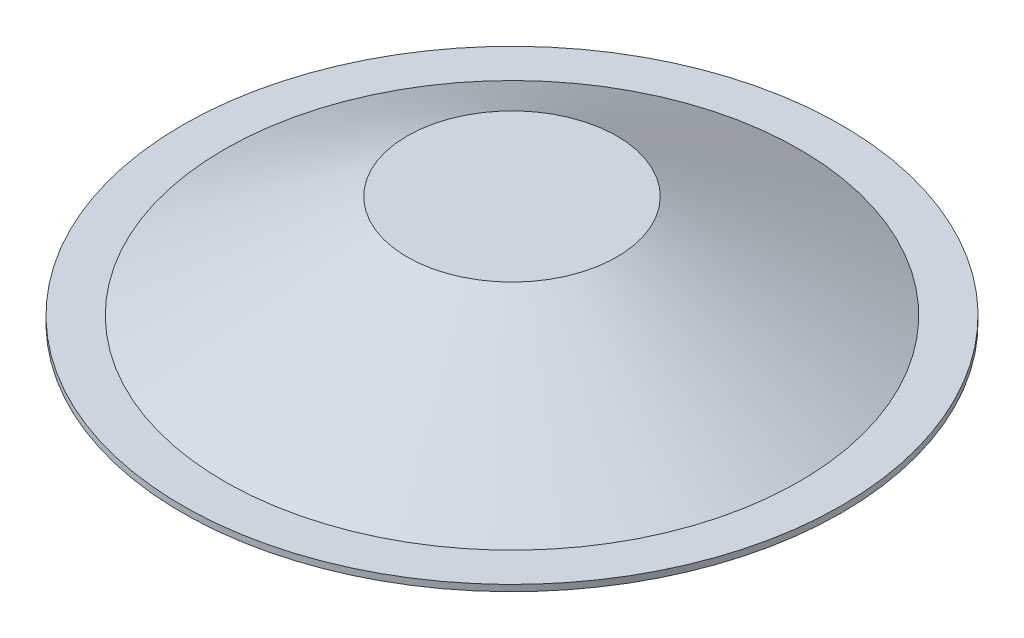
ISO-10303-21;
HEADER;
FILE_DESCRIPTION(('STEP AP214'),'2;1');
FILE_NAME('part.step','',(''),(''),'','','');
FILE_SCHEMA(('AUTOMOTIVE_DESIGN { 1 0 10303 214 1 1 1 1 }'));
ENDSEC;
DATA;
#1=APPLICATION_CONTEXT('core data for automotive mechanical design processes');
#2=APPLICATION_PROTOCOL_DEFINITION('international standard','automotive_design',2000,#1);
#3=PRODUCT_CONTEXT('',#1,'mechanical');
#4=PRODUCT('Part','Part','',(#3));
#5=PRODUCT_RELATED_PRODUCT_CATEGORY('part','',(#4));
#6=PRODUCT_DEFINITION_FORMATION('','',#4);
#7=PRODUCT_DEFINITION_CONTEXT('part definition',#1,'design');
#8=PRODUCT_DEFINITION('design','',#6,#7);
#9=PRODUCT_DEFINITION_SHAPE('','',#8);
#10=(LENGTH_UNIT() NAMED_UNIT(*) SI_UNIT(.MILLI.,.METRE.));
#11=(NAMED_UNIT(*) PLANE_ANGLE_UNIT() SI_UNIT($,.RADIAN.));
#12=(NAMED_UNIT(*) SI_UNIT($,.STERADIAN.) SOLID_ANGLE_UNIT());
#13=UNCERTAINTY_MEASURE_WITH_UNIT(LENGTH_MEASURE(1.E-05),#10,'distance_accuracy_value','');
#14=(GEOMETRIC_REPRESENTATION_CONTEXT(3) GLOBAL_UNCERTAINTY_ASSIGNED_CONTEXT((#13)) GLOBAL_UNIT_ASSIGNED_CONTEXT((#10,
#11,#12)) REPRESENTATION_CONTEXT('',''));
#15=CARTESIAN_POINT('',(0.,0.,0.));
#16=DIRECTION('',(0.,0.,1.));
#17=DIRECTION('',(1.,0.,0.));
#18=AXIS2_PLACEMENT_3D('',#15,#16,#17);
#19=CARTESIAN_POINT('',(0.,-2.99999999999999,0.));
#20=DIRECTION('',(0.,-1.,0.));
#21=DIRECTION('',(1.,0.,0.));
#22=AXIS2_PLACEMENT_3D('',#19,#20,#21);
#23=PLANE('',#22);
#24=CARTESIAN_POINT('',(0.,-2.99999999999999,0.));
#25=DIRECTION('',(0.,1.,0.));
#26=DIRECTION('',(-1.,0.,0.));
#27=AXIS2_PLACEMENT_3D('',#24,#25,#26);
#28=CIRCLE('',#27,49.2130112257197);
#29=CARTESIAN_POINT('',(-49.2130112257197,-3.,0.));
#30=VERTEX_POINT('',#29);
#31=EDGE_CURVE('E59',#30,#30,#28,.T.);
#32=ORIENTED_EDGE('',*,*,#31,.F.);
#33=EDGE_LOOP('',(#32));
#34=FACE_BOUND('',#33,.T.);
#35=ADVANCED_FACE('F37',(#34),#23,.T.);
#36=CARTESIAN_POINT('',(0.,0.,0.));
#37=DIRECTION('',(0.,1.,0.));
#38=DIRECTION('',(-1.,0.,0.));
#39=AXIS2_PLACEMENT_3D('',#36,#37,#38);
#40=PLANE('',#39);
#41=CARTESIAN_POINT('',(0.,0.,0.));
#42=DIRECTION('',(0.,1.,0.));
#43=DIRECTION('',(-1.,0.,0.));
#44=AXIS2_PLACEMENT_3D('',#41,#42,#43);
#45=CIRCLE('',#44,50.);
#46=CARTESIAN_POINT('',(-50.,0.,0.));
#47=VERTEX_POINT('',#46);
#48=EDGE_CURVE('E10',#47,#47,#45,.T.);
#49=ORIENTED_EDGE('',*,*,#48,.T.);
#50=EDGE_LOOP('',(#49));
#51=FACE_BOUND('',#50,.T.);
#52=ADVANCED_FACE('F67',(#51),#40,.T.);
#53=CARTESIAN_POINT('',(0.,0.,0.));
#54=DIRECTION('',(0.,-1.,0.));
#55=DIRECTION('',(1.,0.,0.));
#56=AXIS2_PLACEMENT_3D('',#53,#54,#55);
#57=CONICAL_SURFACE('',#56,50.,1.05769852589075);
#58=CARTESIAN_POINT('',(0.,-49.0878488920703,0.));
#59=DIRECTION('',(0.,1.,0.));
#60=DIRECTION('',(-1.,0.,0.));
#61=AXIS2_PLACEMENT_3D('',#58,#59,#60);
#62=CIRCLE('',#61,137.122804656125);
#63=CARTESIAN_POINT('',(-137.122804656125,-49.0878488920703,0.));
#64=VERTEX_POINT('',#63);
#65=EDGE_CURVE('E43',#64,#64,#62,.T.);
#66=ORIENTED_EDGE('',*,*,#65,.T.);
#67=EDGE_LOOP('',(#66));
#68=FACE_BOUND('',#67,.T.);
#69=ORIENTED_EDGE('',*,*,#48,.F.);
#70=EDGE_LOOP('',(#69));
#71=FACE_BOUND('',#70,.T.);
#72=ADVANCED_FACE('F71',(#68,#71),#57,.T.);
#73=CARTESIAN_POINT('',(-137.122804656125,-49.0878488920703,0.));
#74=DIRECTION('',(0.,1.,0.));
#75=DIRECTION('',(-1.,0.,0.));
#76=AXIS2_PLACEMENT_3D('',#73,#74,#75);
#77=PLANE('',#76);
#78=CARTESIAN_POINT('',(0.,-49.0878488920703,0.));
#79=DIRECTION('',(0.,1.,0.));
#80=DIRECTION('',(-1.,0.,0.));
#81=AXIS2_PLACEMENT_3D('',#78,#79,#80);
#82=CIRCLE('',#81,157.122804656125);
#83=CARTESIAN_POINT('',(-157.122804656125,-49.0878488920703,0.));
#84=VERTEX_POINT('',#83);
#85=EDGE_CURVE('E47',#84,#84,#82,.T.);
#86=ORIENTED_EDGE('',*,*,#85,.T.);
#87=EDGE_LOOP('',(#86));
#88=FACE_BOUND('',#87,.T.);
#89=ORIENTED_EDGE('',*,*,#65,.F.);
#90=EDGE_LOOP('',(#89));
#91=FACE_BOUND('',#90,.T.);
#92=ADVANCED_FACE('F75',(#88,#91),#77,.T.);
#93=CARTESIAN_POINT('',(0.,0.,0.));
#94=DIRECTION('',(0.,1.,0.));
#95=DIRECTION('',(-1.,0.,0.));
#96=AXIS2_PLACEMENT_3D('',#93,#94,#95);
#97=CYLINDRICAL_SURFACE('',#96,157.122804656125);
#98=CARTESIAN_POINT('',(0.,-52.0878488920703,0.));
#99=DIRECTION('',(0.,1.,0.));
#100=DIRECTION('',(-1.,0.,0.));
#101=AXIS2_PLACEMENT_3D('',#98,#99,#100);
#102=CIRCLE('',#101,157.122804656125);
#103=CARTESIAN_POINT('',(-157.122804656125,-52.0878488920703,0.));
#104=VERTEX_POINT('',#103);
#105=EDGE_CURVE('E51',#104,#104,#102,.T.);
#106=ORIENTED_EDGE('',*,*,#105,.T.);
#107=EDGE_LOOP('',(#106));
#108=FACE_BOUND('',#107,.T.);
#109=ORIENTED_EDGE('',*,*,#85,.F.);
#110=EDGE_LOOP('',(#109));
#111=FACE_BOUND('',#110,.T.);
#112=ADVANCED_FACE('F80',(#108,#111),#97,.T.);
#113=CARTESIAN_POINT('',(-157.122804656125,-52.0878488920703,0.));
#114=DIRECTION('',(0.,-1.,0.));
#115=DIRECTION('',(1.,0.,0.));
#116=AXIS2_PLACEMENT_3D('',#113,#114,#115);
#117=PLANE('',#116);
#118=CARTESIAN_POINT('',(0.,-52.0878488920703,0.));
#119=DIRECTION('',(0.,1.,0.));
#120=DIRECTION('',(-1.,0.,0.));
#121=AXIS2_PLACEMENT_3D('',#118,#119,#120);
#122=CIRCLE('',#121,136.335815881845);
#123=CARTESIAN_POINT('',(-136.335815881845,-52.0878488920703,0.));
#124=VERTEX_POINT('',#123);
#125=EDGE_CURVE('E56',#124,#124,#122,.T.);
#126=ORIENTED_EDGE('',*,*,#125,.T.);
#127=EDGE_LOOP('',(#126));
#128=FACE_BOUND('',#127,.T.);
#129=ORIENTED_EDGE('',*,*,#105,.F.);
#130=EDGE_LOOP('',(#129));
#131=FACE_BOUND('',#130,.T.);
#132=ADVANCED_FACE('F84',(#128,#131),#117,.T.);
#133=CARTESIAN_POINT('',(0.,-52.0878488920703,0.));
#134=DIRECTION('',(0.,-1.,0.));
#135=DIRECTION('',(1.,0.,0.));
#136=AXIS2_PLACEMENT_3D('',#133,#134,#135);
#137=CONICAL_SURFACE('',#136,136.335815881845,1.05769852589075);
#138=ORIENTED_EDGE('',*,*,#31,.T.);
#139=EDGE_LOOP('',(#138));
#140=FACE_BOUND('',#139,.T.);
#141=ORIENTED_EDGE('',*,*,#125,.F.);
#142=EDGE_LOOP('',(#141));
#143=FACE_BOUND('',#142,.T.);
#144=ADVANCED_FACE('F63',(#140,#143),#137,.F.);
#145=CLOSED_SHELL('',(#35,#52,#72,#92,#112,#132,#144));
#146=MANIFOLD_SOLID_BREP('B2',#145);
#147=ADVANCED_BREP_SHAPE_REPRESENTATION('',(#18,#146),#14);
#148=SHAPE_DEFINITION_REPRESENTATION(#9,#147);
ENDSEC;
END-ISO-10303-21;
